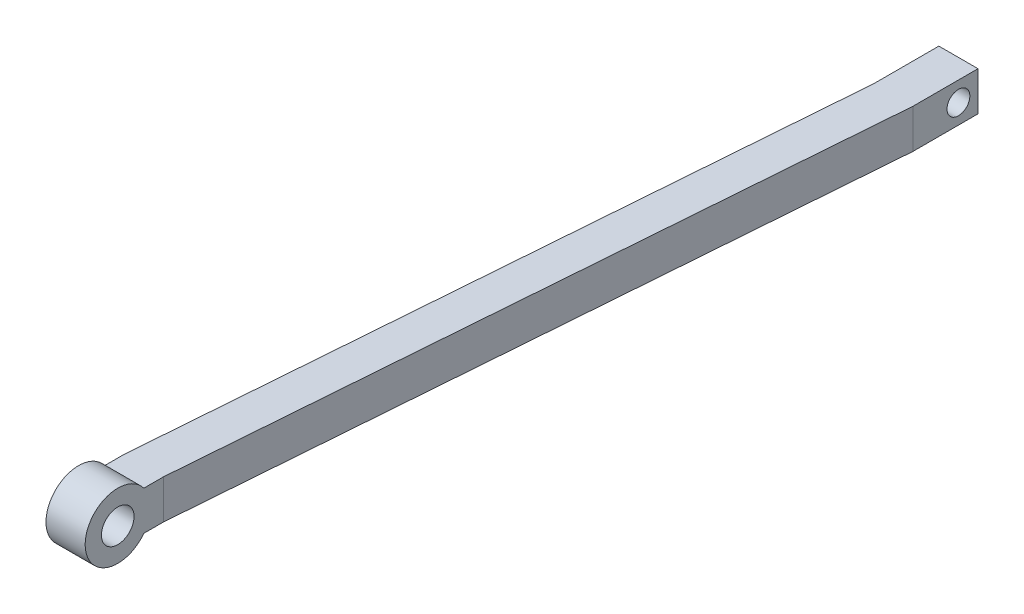
ISO-10303-21;
HEADER;
FILE_DESCRIPTION(('STEP AP214'),'2;1');
FILE_NAME('part.step','',(''),(''),'','','');
FILE_SCHEMA(('AUTOMOTIVE_DESIGN { 1 0 10303 214 1 1 1 1 }'));
ENDSEC;
DATA;
#1=APPLICATION_CONTEXT('core data for automotive mechanical design processes');
#2=APPLICATION_PROTOCOL_DEFINITION('international standard','automotive_design',2000,#1);
#3=PRODUCT_CONTEXT('',#1,'mechanical');
#4=PRODUCT('Part','Part','',(#3));
#5=PRODUCT_RELATED_PRODUCT_CATEGORY('part','',(#4));
#6=PRODUCT_DEFINITION_FORMATION('','',#4);
#7=PRODUCT_DEFINITION_CONTEXT('part definition',#1,'design');
#8=PRODUCT_DEFINITION('design','',#6,#7);
#9=PRODUCT_DEFINITION_SHAPE('','',#8);
#10=(LENGTH_UNIT() NAMED_UNIT(*) SI_UNIT(.MILLI.,.METRE.));
#11=(NAMED_UNIT(*) PLANE_ANGLE_UNIT() SI_UNIT($,.RADIAN.));
#12=(NAMED_UNIT(*) SI_UNIT($,.STERADIAN.) SOLID_ANGLE_UNIT());
#13=UNCERTAINTY_MEASURE_WITH_UNIT(LENGTH_MEASURE(1.E-05),#10,'distance_accuracy_value','');
#14=(GEOMETRIC_REPRESENTATION_CONTEXT(3) GLOBAL_UNCERTAINTY_ASSIGNED_CONTEXT((#13)) GLOBAL_UNIT_ASSIGNED_CONTEXT((#10,
#11,#12)) REPRESENTATION_CONTEXT('',''));
#15=CARTESIAN_POINT('',(0.,0.,0.));
#16=DIRECTION('',(0.,0.,1.));
#17=DIRECTION('',(1.,0.,0.));
#18=AXIS2_PLACEMENT_3D('',#15,#16,#17);
#19=CARTESIAN_POINT('',(4.88771703187096,-12.,0.378111168014772));
#20=DIRECTION('',(0.99702112034367,0.,0.0771290191085871));
#21=DIRECTION('',(0.0771290191085871,0.,-0.99702112034367));
#22=AXIS2_PLACEMENT_3D('',#19,#20,#21);
#23=PLANE('',#22);
#24=DIRECTION('',(0.0771290191085871,0.,-0.99702112034367));
#25=VECTOR('',#24,1.);
#26=CARTESIAN_POINT('',(4.88771703187096,0.,0.378111168014772));
#27=LINE('',#26,#25);
#28=CARTESIAN_POINT('',(6.,0.,-14.));
#29=VERTEX_POINT('',#28);
#30=CARTESIAN_POINT('',(22.5,0.,-227.29));
#31=VERTEX_POINT('',#30);
#32=EDGE_CURVE('E135',#29,#31,#27,.T.);
#33=ORIENTED_EDGE('',*,*,#32,.F.);
#34=DIRECTION('',(0.,1.,0.));
#35=VECTOR('',#34,1.);
#36=CARTESIAN_POINT('',(6.,-12.,-14.));
#37=LINE('',#36,#35);
#38=CARTESIAN_POINT('',(6.,-12.,-14.));
#39=VERTEX_POINT('',#38);
#40=EDGE_CURVE('E46',#39,#29,#37,.T.);
#41=ORIENTED_EDGE('',*,*,#40,.F.);
#42=DIRECTION('',(0.0771290191085871,0.,-0.99702112034367));
#43=VECTOR('',#42,1.);
#44=CARTESIAN_POINT('',(4.88771703187096,-12.,0.378111168014772));
#45=LINE('',#44,#43);
#46=CARTESIAN_POINT('',(22.5,-12.,-227.29));
#47=VERTEX_POINT('',#46);
#48=EDGE_CURVE('E111',#39,#47,#45,.T.);
#49=ORIENTED_EDGE('',*,*,#48,.T.);
#50=DIRECTION('',(0.,1.,0.));
#51=VECTOR('',#50,1.);
#52=CARTESIAN_POINT('',(22.5,-12.,-227.29));
#53=LINE('',#52,#51);
#54=EDGE_CURVE('E154',#47,#31,#53,.T.);
#55=ORIENTED_EDGE('',*,*,#54,.T.);
#56=EDGE_LOOP('',(#33,#41,#49,#55));
#57=FACE_BOUND('',#56,.T.);
#58=ADVANCED_FACE('F39',(#57),#23,.T.);
#59=CARTESIAN_POINT('',(6.,-12.,0.));
#60=DIRECTION('',(1.,0.,0.));
#61=DIRECTION('',(0.,0.,-1.));
#62=AXIS2_PLACEMENT_3D('',#59,#60,#61);
#63=PLANE('',#62);
#64=DIRECTION('',(0.,0.,-1.));
#65=VECTOR('',#64,1.);
#66=CARTESIAN_POINT('',(6.,0.,0.));
#67=LINE('',#66,#65);
#68=CARTESIAN_POINT('',(6.,0.,-8.00000000000001));
#69=VERTEX_POINT('',#68);
#70=EDGE_CURVE('E101',#69,#29,#67,.T.);
#71=ORIENTED_EDGE('',*,*,#70,.F.);
#72=CARTESIAN_POINT('',(6.,-6.,0.));
#73=DIRECTION('',(1.,0.,0.));
#74=DIRECTION('',(0.,0.,-1.));
#75=AXIS2_PLACEMENT_3D('',#72,#73,#74);
#76=CIRCLE('',#75,10.);
#77=CARTESIAN_POINT('',(6.,-12.,-8.00000000000001));
#78=VERTEX_POINT('',#77);
#79=EDGE_CURVE('E106',#78,#69,#76,.F.);
#80=ORIENTED_EDGE('',*,*,#79,.F.);
#81=DIRECTION('',(0.,0.,-1.));
#82=VECTOR('',#81,1.);
#83=CARTESIAN_POINT('',(6.,-12.,0.));
#84=LINE('',#83,#82);
#85=EDGE_CURVE('E58',#78,#39,#84,.T.);
#86=ORIENTED_EDGE('',*,*,#85,.T.);
#87=ORIENTED_EDGE('',*,*,#40,.T.);
#88=EDGE_LOOP('',(#71,#80,#86,#87));
#89=FACE_BOUND('',#88,.T.);
#90=CARTESIAN_POINT('',(6.,-6.,0.));
#91=DIRECTION('',(1.,0.,0.));
#92=DIRECTION('',(0.,0.,-1.));
#93=AXIS2_PLACEMENT_3D('',#90,#91,#92);
#94=CIRCLE('',#93,5.);
#95=CARTESIAN_POINT('',(6.,-6.,-5.));
#96=VERTEX_POINT('',#95);
#97=EDGE_CURVE('E129',#96,#96,#94,.F.);
#98=ORIENTED_EDGE('',*,*,#97,.T.);
#99=EDGE_LOOP('',(#98));
#100=FACE_BOUND('',#99,.T.);
#101=ADVANCED_FACE('F103',(#89,#100),#63,.T.);
#102=CARTESIAN_POINT('',(-6.,-12.,0.));
#103=DIRECTION('',(1.,0.,0.));
#104=DIRECTION('',(0.,0.,-1.));
#105=AXIS2_PLACEMENT_3D('',#102,#103,#104);
#106=PLANE('',#105);
#107=DIRECTION('',(0.,0.,-1.));
#108=VECTOR('',#107,1.);
#109=CARTESIAN_POINT('',(-6.,-12.,0.));
#110=LINE('',#109,#108);
#111=CARTESIAN_POINT('',(-6.,-12.,-8.00000000000001));
#112=VERTEX_POINT('',#111);
#113=CARTESIAN_POINT('',(-6.,-12.,-14.));
#114=VERTEX_POINT('',#113);
#115=EDGE_CURVE('E151',#112,#114,#110,.T.);
#116=ORIENTED_EDGE('',*,*,#115,.F.);
#117=CARTESIAN_POINT('',(-6.,-6.,0.));
#118=DIRECTION('',(-1.,0.,0.));
#119=DIRECTION('',(0.,0.,1.));
#120=AXIS2_PLACEMENT_3D('',#117,#118,#119);
#121=CIRCLE('',#120,10.);
#122=CARTESIAN_POINT('',(-6.,0.,-8.00000000000001));
#123=VERTEX_POINT('',#122);
#124=EDGE_CURVE('E120',#112,#123,#121,.T.);
#125=ORIENTED_EDGE('',*,*,#124,.T.);
#126=DIRECTION('',(0.,0.,-1.));
#127=VECTOR('',#126,1.);
#128=CARTESIAN_POINT('',(-6.,0.,0.));
#129=LINE('',#128,#127);
#130=CARTESIAN_POINT('',(-6.,0.,-14.));
#131=VERTEX_POINT('',#130);
#132=EDGE_CURVE('E112',#123,#131,#129,.T.);
#133=ORIENTED_EDGE('',*,*,#132,.T.);
#134=DIRECTION('',(0.,1.,0.));
#135=VECTOR('',#134,1.);
#136=CARTESIAN_POINT('',(-6.,-12.,-14.));
#137=LINE('',#136,#135);
#138=EDGE_CURVE('E169',#114,#131,#137,.T.);
#139=ORIENTED_EDGE('',*,*,#138,.F.);
#140=EDGE_LOOP('',(#116,#125,#133,#139));
#141=FACE_BOUND('',#140,.T.);
#142=CARTESIAN_POINT('',(-6.,-6.,0.));
#143=DIRECTION('',(-1.,0.,0.));
#144=DIRECTION('',(0.,0.,1.));
#145=AXIS2_PLACEMENT_3D('',#142,#143,#144);
#146=CIRCLE('',#145,5.);
#147=CARTESIAN_POINT('',(-6.,-6.,5.));
#148=VERTEX_POINT('',#147);
#149=EDGE_CURVE('E132',#148,#148,#146,.T.);
#150=ORIENTED_EDGE('',*,*,#149,.F.);
#151=EDGE_LOOP('',(#150));
#152=FACE_BOUND('',#151,.T.);
#153=ADVANCED_FACE('F196',(#141,#152),#106,.F.);
#154=CARTESIAN_POINT('',(-7.04089634106521,-12.,-0.54467996449705));
#155=DIRECTION('',(-0.99702112034367,0.,-0.0771290191085871));
#156=DIRECTION('',(-0.0771290191085871,0.,0.99702112034367));
#157=AXIS2_PLACEMENT_3D('',#154,#155,#156);
#158=PLANE('',#157);
#159=DIRECTION('',(-0.0771290191085871,0.,0.99702112034367));
#160=VECTOR('',#159,1.);
#161=CARTESIAN_POINT('',(-7.04089634106521,0.,-0.54467996449705));
#162=LINE('',#161,#160);
#163=CARTESIAN_POINT('',(10.5,0.,-227.29));
#164=VERTEX_POINT('',#163);
#165=EDGE_CURVE('E165',#164,#131,#162,.T.);
#166=ORIENTED_EDGE('',*,*,#165,.F.);
#167=DIRECTION('',(0.,1.,0.));
#168=VECTOR('',#167,1.);
#169=CARTESIAN_POINT('',(10.5,-12.,-227.29));
#170=LINE('',#169,#168);
#171=CARTESIAN_POINT('',(10.5,-12.,-227.29));
#172=VERTEX_POINT('',#171);
#173=EDGE_CURVE('E172',#172,#164,#170,.T.);
#174=ORIENTED_EDGE('',*,*,#173,.F.);
#175=DIRECTION('',(-0.0771290191085871,0.,0.99702112034367));
#176=VECTOR('',#175,1.);
#177=CARTESIAN_POINT('',(-7.04089634106521,-12.,-0.54467996449705));
#178=LINE('',#177,#176);
#179=EDGE_CURVE('E148',#172,#114,#178,.T.);
#180=ORIENTED_EDGE('',*,*,#179,.T.);
#181=ORIENTED_EDGE('',*,*,#138,.T.);
#182=EDGE_LOOP('',(#166,#174,#180,#181));
#183=FACE_BOUND('',#182,.T.);
#184=ADVANCED_FACE('F193',(#183),#158,.T.);
#185=CARTESIAN_POINT('',(10.5,-12.,0.));
#186=DIRECTION('',(-1.,0.,0.));
#187=DIRECTION('',(0.,0.,1.));
#188=AXIS2_PLACEMENT_3D('',#185,#186,#187);
#189=PLANE('',#188);
#190=CARTESIAN_POINT('',(10.5,-6.,-241.29));
#191=DIRECTION('',(-1.,0.,0.));
#192=DIRECTION('',(0.,0.,1.));
#193=AXIS2_PLACEMENT_3D('',#190,#191,#192);
#194=CIRCLE('',#193,3.49999999999999);
#195=CARTESIAN_POINT('',(10.5,-6.,-237.79));
#196=VERTEX_POINT('',#195);
#197=EDGE_CURVE('E125',#196,#196,#194,.F.);
#198=ORIENTED_EDGE('',*,*,#197,.T.);
#199=EDGE_LOOP('',(#198));
#200=FACE_BOUND('',#199,.T.);
#201=DIRECTION('',(0.,0.,1.));
#202=VECTOR('',#201,1.);
#203=CARTESIAN_POINT('',(10.5,0.,0.));
#204=LINE('',#203,#202);
#205=CARTESIAN_POINT('',(10.5,0.,-247.29));
#206=VERTEX_POINT('',#205);
#207=EDGE_CURVE('E162',#206,#164,#204,.T.);
#208=ORIENTED_EDGE('',*,*,#207,.F.);
#209=DIRECTION('',(0.,1.,0.));
#210=VECTOR('',#209,1.);
#211=CARTESIAN_POINT('',(10.5,-12.,-247.29));
#212=LINE('',#211,#210);
#213=CARTESIAN_POINT('',(10.5,-12.,-247.29));
#214=VERTEX_POINT('',#213);
#215=EDGE_CURVE('E174',#214,#206,#212,.T.);
#216=ORIENTED_EDGE('',*,*,#215,.F.);
#217=DIRECTION('',(0.,0.,1.));
#218=VECTOR('',#217,1.);
#219=CARTESIAN_POINT('',(10.5,-12.,0.));
#220=LINE('',#219,#218);
#221=EDGE_CURVE('E145',#214,#172,#220,.T.);
#222=ORIENTED_EDGE('',*,*,#221,.T.);
#223=ORIENTED_EDGE('',*,*,#173,.T.);
#224=EDGE_LOOP('',(#208,#216,#222,#223));
#225=FACE_BOUND('',#224,.T.);
#226=ADVANCED_FACE('F187',(#200,#225),#189,.T.);
#227=CARTESIAN_POINT('',(0.,-12.,-247.29));
#228=DIRECTION('',(0.,0.,1.));
#229=DIRECTION('',(1.,0.,0.));
#230=AXIS2_PLACEMENT_3D('',#227,#228,#229);
#231=PLANE('',#230);
#232=DIRECTION('',(1.,0.,0.));
#233=VECTOR('',#232,1.);
#234=CARTESIAN_POINT('',(0.,0.,-247.29));
#235=LINE('',#234,#233);
#236=CARTESIAN_POINT('',(22.5,0.,-247.29));
#237=VERTEX_POINT('',#236);
#238=EDGE_CURVE('E159',#206,#237,#235,.T.);
#239=ORIENTED_EDGE('',*,*,#238,.T.);
#240=DIRECTION('',(0.,1.,0.));
#241=VECTOR('',#240,1.);
#242=CARTESIAN_POINT('',(22.5,-12.,-247.29));
#243=LINE('',#242,#241);
#244=CARTESIAN_POINT('',(22.5,-12.,-247.29));
#245=VERTEX_POINT('',#244);
#246=EDGE_CURVE('E176',#245,#237,#243,.T.);
#247=ORIENTED_EDGE('',*,*,#246,.F.);
#248=DIRECTION('',(1.,0.,0.));
#249=VECTOR('',#248,1.);
#250=CARTESIAN_POINT('',(0.,-12.,-247.29));
#251=LINE('',#250,#249);
#252=EDGE_CURVE('E143',#214,#245,#251,.T.);
#253=ORIENTED_EDGE('',*,*,#252,.F.);
#254=ORIENTED_EDGE('',*,*,#215,.T.);
#255=EDGE_LOOP('',(#239,#247,#253,#254));
#256=FACE_BOUND('',#255,.T.);
#257=ADVANCED_FACE('F199',(#256),#231,.F.);
#258=CARTESIAN_POINT('',(22.5,-12.,0.));
#259=DIRECTION('',(1.,0.,0.));
#260=DIRECTION('',(0.,0.,-1.));
#261=AXIS2_PLACEMENT_3D('',#258,#259,#260);
#262=PLANE('',#261);
#263=CARTESIAN_POINT('',(22.5,-6.,-241.29));
#264=DIRECTION('',(1.,0.,0.));
#265=DIRECTION('',(0.,0.,-1.));
#266=AXIS2_PLACEMENT_3D('',#263,#264,#265);
#267=CIRCLE('',#266,3.49999999999999);
#268=CARTESIAN_POINT('',(22.5,-6.,-244.79));
#269=VERTEX_POINT('',#268);
#270=EDGE_CURVE('E126',#269,#269,#267,.T.);
#271=ORIENTED_EDGE('',*,*,#270,.F.);
#272=EDGE_LOOP('',(#271));
#273=FACE_BOUND('',#272,.T.);
#274=DIRECTION('',(0.,0.,-1.));
#275=VECTOR('',#274,1.);
#276=CARTESIAN_POINT('',(22.5,0.,0.));
#277=LINE('',#276,#275);
#278=EDGE_CURVE('E156',#31,#237,#277,.T.);
#279=ORIENTED_EDGE('',*,*,#278,.F.);
#280=ORIENTED_EDGE('',*,*,#54,.F.);
#281=DIRECTION('',(0.,0.,-1.));
#282=VECTOR('',#281,1.);
#283=CARTESIAN_POINT('',(22.5,-12.,0.));
#284=LINE('',#283,#282);
#285=EDGE_CURVE('E140',#47,#245,#284,.T.);
#286=ORIENTED_EDGE('',*,*,#285,.T.);
#287=ORIENTED_EDGE('',*,*,#246,.T.);
#288=EDGE_LOOP('',(#279,#280,#286,#287));
#289=FACE_BOUND('',#288,.T.);
#290=ADVANCED_FACE('F181',(#273,#289),#262,.T.);
#291=CARTESIAN_POINT('',(0.,-12.,0.));
#292=DIRECTION('',(0.,1.,0.));
#293=DIRECTION('',(0.,0.,1.));
#294=AXIS2_PLACEMENT_3D('',#291,#292,#293);
#295=PLANE('',#294);
#296=ORIENTED_EDGE('',*,*,#85,.F.);
#297=DIRECTION('',(-1.,0.,0.));
#298=VECTOR('',#297,1.);
#299=CARTESIAN_POINT('',(34.2842712474619,-12.,-8.00000000000001));
#300=LINE('',#299,#298);
#301=EDGE_CURVE('E53',#78,#112,#300,.T.);
#302=ORIENTED_EDGE('',*,*,#301,.T.);
#303=ORIENTED_EDGE('',*,*,#115,.T.);
#304=ORIENTED_EDGE('',*,*,#179,.F.);
#305=ORIENTED_EDGE('',*,*,#221,.F.);
#306=ORIENTED_EDGE('',*,*,#252,.T.);
#307=ORIENTED_EDGE('',*,*,#285,.F.);
#308=ORIENTED_EDGE('',*,*,#48,.F.);
#309=EDGE_LOOP('',(#296,#302,#303,#304,#305,#306,#307,#308));
#310=FACE_BOUND('',#309,.T.);
#311=ADVANCED_FACE('F198',(#310),#295,.F.);
#312=CARTESIAN_POINT('',(0.,0.,0.));
#313=DIRECTION('',(0.,1.,0.));
#314=DIRECTION('',(0.,0.,1.));
#315=AXIS2_PLACEMENT_3D('',#312,#313,#314);
#316=PLANE('',#315);
#317=DIRECTION('',(-1.,0.,0.));
#318=VECTOR('',#317,1.);
#319=CARTESIAN_POINT('',(34.2842712474619,0.,-8.00000000000001));
#320=LINE('',#319,#318);
#321=EDGE_CURVE('E11',#69,#123,#320,.T.);
#322=ORIENTED_EDGE('',*,*,#321,.F.);
#323=ORIENTED_EDGE('',*,*,#70,.T.);
#324=ORIENTED_EDGE('',*,*,#32,.T.);
#325=ORIENTED_EDGE('',*,*,#278,.T.);
#326=ORIENTED_EDGE('',*,*,#238,.F.);
#327=ORIENTED_EDGE('',*,*,#207,.T.);
#328=ORIENTED_EDGE('',*,*,#165,.T.);
#329=ORIENTED_EDGE('',*,*,#132,.F.);
#330=EDGE_LOOP('',(#322,#323,#324,#325,#326,#327,#328,#329));
#331=FACE_BOUND('',#330,.T.);
#332=ADVANCED_FACE('F114',(#331),#316,.T.);
#333=CARTESIAN_POINT('',(22.501,-6.,0.));
#334=DIRECTION('',(-1.,0.,0.));
#335=DIRECTION('',(0.,0.,1.));
#336=AXIS2_PLACEMENT_3D('',#333,#334,#335);
#337=CYLINDRICAL_SURFACE('',#336,5.);
#338=ORIENTED_EDGE('',*,*,#97,.F.);
#339=EDGE_LOOP('',(#338));
#340=FACE_BOUND('',#339,.T.);
#341=ORIENTED_EDGE('',*,*,#149,.T.);
#342=EDGE_LOOP('',(#341));
#343=FACE_BOUND('',#342,.T.);
#344=ADVANCED_FACE('F238',(#340,#343),#337,.F.);
#345=CARTESIAN_POINT('',(-6.001,-6.,-241.29));
#346=DIRECTION('',(1.,0.,0.));
#347=DIRECTION('',(0.,0.,-1.));
#348=AXIS2_PLACEMENT_3D('',#345,#346,#347);
#349=CYLINDRICAL_SURFACE('',#348,3.49999999999999);
#350=ORIENTED_EDGE('',*,*,#197,.F.);
#351=EDGE_LOOP('',(#350));
#352=FACE_BOUND('',#351,.T.);
#353=ORIENTED_EDGE('',*,*,#270,.T.);
#354=EDGE_LOOP('',(#353));
#355=FACE_BOUND('',#354,.T.);
#356=ADVANCED_FACE('F251',(#352,#355),#349,.F.);
#357=CARTESIAN_POINT('',(34.2842712474619,-6.,0.));
#358=DIRECTION('',(-1.,0.,0.));
#359=DIRECTION('',(0.,0.,1.));
#360=AXIS2_PLACEMENT_3D('',#357,#358,#359);
#361=CYLINDRICAL_SURFACE('',#360,10.);
#362=ORIENTED_EDGE('',*,*,#301,.F.);
#363=ORIENTED_EDGE('',*,*,#79,.T.);
#364=ORIENTED_EDGE('',*,*,#321,.T.);
#365=ORIENTED_EDGE('',*,*,#124,.F.);
#366=EDGE_LOOP('',(#362,#363,#364,#365));
#367=FACE_BOUND('',#366,.T.);
#368=ADVANCED_FACE('F119',(#367),#361,.T.);
#369=CLOSED_SHELL('',(#58,#101,#153,#184,#226,#257,#290,#311,#332,#344,#356,#368));
#370=MANIFOLD_SOLID_BREP('B2',#369);
#371=ADVANCED_BREP_SHAPE_REPRESENTATION('',(#18,#370),#14);
#372=SHAPE_DEFINITION_REPRESENTATION(#9,#371);
ENDSEC;
END-ISO-10303-21;
